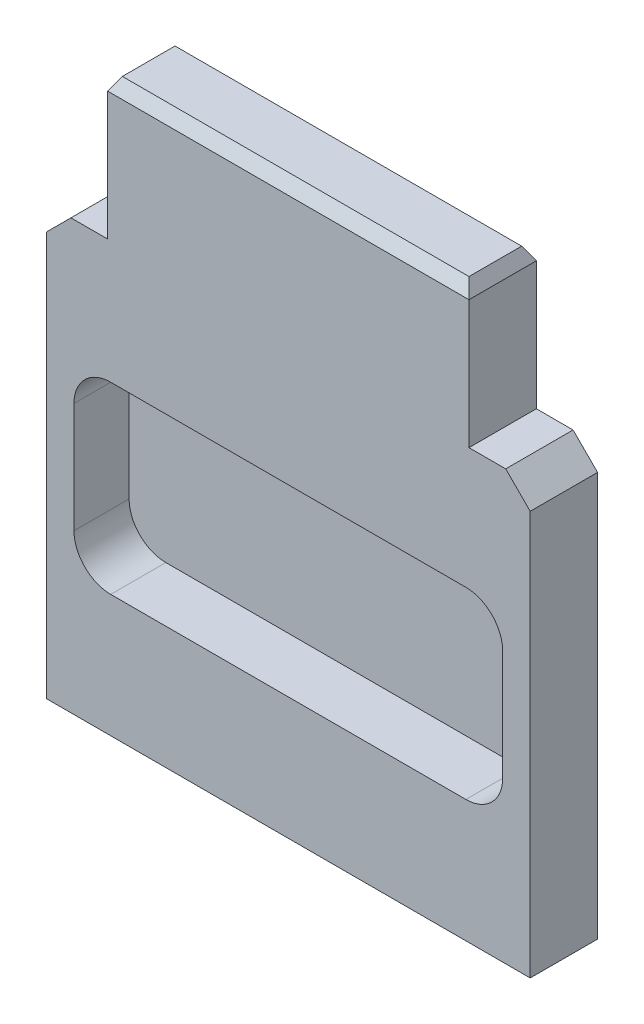
ISO-10303-21;
HEADER;
FILE_DESCRIPTION(('STEP AP214'),'2;1');
FILE_NAME('part.step','',(''),(''),'','','');
FILE_SCHEMA(('AUTOMOTIVE_DESIGN { 1 0 10303 214 1 1 1 1 }'));
ENDSEC;
DATA;
#1=APPLICATION_CONTEXT('core data for automotive mechanical design processes');
#2=APPLICATION_PROTOCOL_DEFINITION('international standard','automotive_design',2000,#1);
#3=PRODUCT_CONTEXT('',#1,'mechanical');
#4=PRODUCT('Part','Part','',(#3));
#5=PRODUCT_RELATED_PRODUCT_CATEGORY('part','',(#4));
#6=PRODUCT_DEFINITION_FORMATION('','',#4);
#7=PRODUCT_DEFINITION_CONTEXT('part definition',#1,'design');
#8=PRODUCT_DEFINITION('design','',#6,#7);
#9=PRODUCT_DEFINITION_SHAPE('','',#8);
#10=(LENGTH_UNIT() NAMED_UNIT(*) SI_UNIT(.MILLI.,.METRE.));
#11=(NAMED_UNIT(*) PLANE_ANGLE_UNIT() SI_UNIT($,.RADIAN.));
#12=(NAMED_UNIT(*) SI_UNIT($,.STERADIAN.) SOLID_ANGLE_UNIT());
#13=UNCERTAINTY_MEASURE_WITH_UNIT(LENGTH_MEASURE(1.E-05),#10,'distance_accuracy_value','');
#14=(GEOMETRIC_REPRESENTATION_CONTEXT(3) GLOBAL_UNCERTAINTY_ASSIGNED_CONTEXT((#13)) GLOBAL_UNIT_ASSIGNED_CONTEXT((#10,
#11,#12)) REPRESENTATION_CONTEXT('',''));
#15=CARTESIAN_POINT('',(0.,0.,0.));
#16=DIRECTION('',(0.,0.,1.));
#17=DIRECTION('',(1.,0.,0.));
#18=AXIS2_PLACEMENT_3D('',#15,#16,#17);
#19=CARTESIAN_POINT('',(-19.75,0.,5.5));
#20=DIRECTION('',(1.,0.,0.));
#21=DIRECTION('',(0.,0.,-1.));
#22=AXIS2_PLACEMENT_3D('',#19,#20,#21);
#23=PLANE('',#22);
#24=DIRECTION('',(0.,-1.,0.));
#25=VECTOR('',#24,1.);
#26=CARTESIAN_POINT('',(-19.75,0.,0.));
#27=LINE('',#26,#25);
#28=CARTESIAN_POINT('',(-19.75,33.,0.));
#29=VERTEX_POINT('',#28);
#30=CARTESIAN_POINT('',(-19.75,0.,0.));
#31=VERTEX_POINT('',#30);
#32=EDGE_CURVE('E201',#29,#31,#27,.T.);
#33=ORIENTED_EDGE('',*,*,#32,.T.);
#34=DIRECTION('',(0.,0.,-1.));
#35=VECTOR('',#34,1.);
#36=CARTESIAN_POINT('',(-19.75,0.,5.5));
#37=LINE('',#36,#35);
#38=CARTESIAN_POINT('',(-19.75,0.,5.5));
#39=VERTEX_POINT('',#38);
#40=EDGE_CURVE('E181',#39,#31,#37,.T.);
#41=ORIENTED_EDGE('',*,*,#40,.F.);
#42=DIRECTION('',(0.,-1.,0.));
#43=VECTOR('',#42,1.);
#44=CARTESIAN_POINT('',(-19.75,0.,5.5));
#45=LINE('',#44,#43);
#46=CARTESIAN_POINT('',(-19.75,33.,5.5));
#47=VERTEX_POINT('',#46);
#48=EDGE_CURVE('E188',#47,#39,#45,.T.);
#49=ORIENTED_EDGE('',*,*,#48,.F.);
#50=DIRECTION('',(0.,0.,-1.));
#51=VECTOR('',#50,1.);
#52=CARTESIAN_POINT('',(-19.75,33.,5.5));
#53=LINE('',#52,#51);
#54=EDGE_CURVE('E309',#47,#29,#53,.T.);
#55=ORIENTED_EDGE('',*,*,#54,.T.);
#56=EDGE_LOOP('',(#33,#41,#49,#55));
#57=FACE_BOUND('',#56,.T.);
#58=ADVANCED_FACE('F39',(#57),#23,.F.);
#59=CARTESIAN_POINT('',(19.75,0.,5.5));
#60=DIRECTION('',(0.,1.,0.));
#61=DIRECTION('',(0.,0.,1.));
#62=AXIS2_PLACEMENT_3D('',#59,#60,#61);
#63=PLANE('',#62);
#64=CARTESIAN_POINT('',(0.,0.,2.5));
#65=DIRECTION('',(0.,1.,0.));
#66=DIRECTION('',(0.,0.,1.));
#67=AXIS2_PLACEMENT_3D('',#64,#65,#66);
#68=CIRCLE('',#67,1.);
#69=CARTESIAN_POINT('',(0.,0.,3.5));
#70=VERTEX_POINT('',#69);
#71=EDGE_CURVE('E12',#70,#70,#68,.F.);
#72=ORIENTED_EDGE('',*,*,#71,.F.);
#73=EDGE_LOOP('',(#72));
#74=FACE_BOUND('',#73,.T.);
#75=DIRECTION('',(1.,0.,0.));
#76=VECTOR('',#75,1.);
#77=CARTESIAN_POINT('',(19.75,0.,0.));
#78=LINE('',#77,#76);
#79=CARTESIAN_POINT('',(19.75,0.,0.));
#80=VERTEX_POINT('',#79);
#81=EDGE_CURVE('E311',#31,#80,#78,.T.);
#82=ORIENTED_EDGE('',*,*,#81,.T.);
#83=DIRECTION('',(0.,0.,-1.));
#84=VECTOR('',#83,1.);
#85=CARTESIAN_POINT('',(19.75,0.,5.5));
#86=LINE('',#85,#84);
#87=CARTESIAN_POINT('',(19.75,0.,5.5));
#88=VERTEX_POINT('',#87);
#89=EDGE_CURVE('E184',#88,#80,#86,.T.);
#90=ORIENTED_EDGE('',*,*,#89,.F.);
#91=DIRECTION('',(1.,0.,0.));
#92=VECTOR('',#91,1.);
#93=CARTESIAN_POINT('',(19.75,0.,5.5));
#94=LINE('',#93,#92);
#95=EDGE_CURVE('E177',#39,#88,#94,.T.);
#96=ORIENTED_EDGE('',*,*,#95,.F.);
#97=ORIENTED_EDGE('',*,*,#40,.T.);
#98=EDGE_LOOP('',(#82,#90,#96,#97));
#99=FACE_BOUND('',#98,.T.);
#100=ADVANCED_FACE('F179',(#74,#99),#63,.F.);
#101=CARTESIAN_POINT('',(19.75,0.,5.5));
#102=DIRECTION('',(-1.,0.,0.));
#103=DIRECTION('',(0.,0.,1.));
#104=AXIS2_PLACEMENT_3D('',#101,#102,#103);
#105=PLANE('',#104);
#106=DIRECTION('',(0.,1.,0.));
#107=VECTOR('',#106,1.);
#108=CARTESIAN_POINT('',(19.75,0.,0.));
#109=LINE('',#108,#107);
#110=CARTESIAN_POINT('',(19.75,33.,0.));
#111=VERTEX_POINT('',#110);
#112=EDGE_CURVE('E313',#80,#111,#109,.T.);
#113=ORIENTED_EDGE('',*,*,#112,.T.);
#114=DIRECTION('',(0.,0.,-1.));
#115=VECTOR('',#114,1.);
#116=CARTESIAN_POINT('',(19.75,33.,5.5));
#117=LINE('',#116,#115);
#118=CARTESIAN_POINT('',(19.75,33.,5.5));
#119=VERTEX_POINT('',#118);
#120=EDGE_CURVE('E206',#119,#111,#117,.T.);
#121=ORIENTED_EDGE('',*,*,#120,.F.);
#122=DIRECTION('',(0.,1.,0.));
#123=VECTOR('',#122,1.);
#124=CARTESIAN_POINT('',(19.75,0.,5.5));
#125=LINE('',#124,#123);
#126=EDGE_CURVE('E187',#88,#119,#125,.T.);
#127=ORIENTED_EDGE('',*,*,#126,.F.);
#128=ORIENTED_EDGE('',*,*,#89,.T.);
#129=EDGE_LOOP('',(#113,#121,#127,#128));
#130=FACE_BOUND('',#129,.T.);
#131=ADVANCED_FACE('F363',(#130),#105,.F.);
#132=CARTESIAN_POINT('',(19.75,33.,5.5));
#133=DIRECTION('',(-0.707106781186545,-0.70710678118655,0.));
#134=DIRECTION('',(0.70710678118655,-0.707106781186545,0.));
#135=AXIS2_PLACEMENT_3D('',#132,#133,#134);
#136=PLANE('',#135);
#137=DIRECTION('',(-0.70710678118655,0.707106781186545,0.));
#138=VECTOR('',#137,1.);
#139=CARTESIAN_POINT('',(19.75,33.,0.));
#140=LINE('',#139,#138);
#141=CARTESIAN_POINT('',(17.75,35.,0.));
#142=VERTEX_POINT('',#141);
#143=EDGE_CURVE('E315',#111,#142,#140,.T.);
#144=ORIENTED_EDGE('',*,*,#143,.T.);
#145=DIRECTION('',(0.,0.,-1.));
#146=VECTOR('',#145,1.);
#147=CARTESIAN_POINT('',(17.75,35.,5.5));
#148=LINE('',#147,#146);
#149=CARTESIAN_POINT('',(17.75,35.,5.5));
#150=VERTEX_POINT('',#149);
#151=EDGE_CURVE('E337',#150,#142,#148,.T.);
#152=ORIENTED_EDGE('',*,*,#151,.F.);
#153=DIRECTION('',(-0.70710678118655,0.707106781186545,0.));
#154=VECTOR('',#153,1.);
#155=CARTESIAN_POINT('',(19.75,33.,5.5));
#156=LINE('',#155,#154);
#157=EDGE_CURVE('E298',#119,#150,#156,.T.);
#158=ORIENTED_EDGE('',*,*,#157,.F.);
#159=ORIENTED_EDGE('',*,*,#120,.T.);
#160=EDGE_LOOP('',(#144,#152,#158,#159));
#161=FACE_BOUND('',#160,.T.);
#162=ADVANCED_FACE('F344',(#161),#136,.F.);
#163=CARTESIAN_POINT('',(17.75,35.,5.5));
#164=DIRECTION('',(0.,-1.,0.));
#165=DIRECTION('',(0.,0.,-1.));
#166=AXIS2_PLACEMENT_3D('',#163,#164,#165);
#167=PLANE('',#166);
#168=DIRECTION('',(-1.,0.,0.));
#169=VECTOR('',#168,1.);
#170=CARTESIAN_POINT('',(17.75,35.,0.));
#171=LINE('',#170,#169);
#172=CARTESIAN_POINT('',(14.75,35.,0.));
#173=VERTEX_POINT('',#172);
#174=EDGE_CURVE('E317',#142,#173,#171,.T.);
#175=ORIENTED_EDGE('',*,*,#174,.T.);
#176=DIRECTION('',(0.,0.,-1.));
#177=VECTOR('',#176,1.);
#178=CARTESIAN_POINT('',(14.75,35.,5.5));
#179=LINE('',#178,#177);
#180=CARTESIAN_POINT('',(14.75,35.,5.5));
#181=VERTEX_POINT('',#180);
#182=EDGE_CURVE('E334',#181,#173,#179,.T.);
#183=ORIENTED_EDGE('',*,*,#182,.F.);
#184=DIRECTION('',(-1.,0.,0.));
#185=VECTOR('',#184,1.);
#186=CARTESIAN_POINT('',(17.75,35.,5.5));
#187=LINE('',#186,#185);
#188=EDGE_CURVE('E300',#150,#181,#187,.T.);
#189=ORIENTED_EDGE('',*,*,#188,.F.);
#190=ORIENTED_EDGE('',*,*,#151,.T.);
#191=EDGE_LOOP('',(#175,#183,#189,#190));
#192=FACE_BOUND('',#191,.T.);
#193=ADVANCED_FACE('F355',(#192),#167,.F.);
#194=CARTESIAN_POINT('',(14.75,35.,5.5));
#195=DIRECTION('',(-1.,0.,0.));
#196=DIRECTION('',(0.,0.,1.));
#197=AXIS2_PLACEMENT_3D('',#194,#195,#196);
#198=PLANE('',#197);
#199=DIRECTION('',(0.,1.,0.));
#200=VECTOR('',#199,1.);
#201=CARTESIAN_POINT('',(14.75,35.,0.));
#202=LINE('',#201,#200);
#203=CARTESIAN_POINT('',(14.75,45.4607695154587,0.));
#204=VERTEX_POINT('',#203);
#205=EDGE_CURVE('E319',#173,#204,#202,.T.);
#206=ORIENTED_EDGE('',*,*,#205,.T.);
#207=DIRECTION('',(0.,0.,1.));
#208=VECTOR('',#207,1.);
#209=CARTESIAN_POINT('',(14.75,45.4607695154587,5.5));
#210=LINE('',#209,#208);
#211=CARTESIAN_POINT('',(14.75,45.4607695154587,5.5));
#212=VERTEX_POINT('',#211);
#213=EDGE_CURVE('E216',#204,#212,#210,.T.);
#214=ORIENTED_EDGE('',*,*,#213,.T.);
#215=DIRECTION('',(0.,1.,0.));
#216=VECTOR('',#215,1.);
#217=CARTESIAN_POINT('',(14.75,35.,5.5));
#218=LINE('',#217,#216);
#219=EDGE_CURVE('E302',#181,#212,#218,.T.);
#220=ORIENTED_EDGE('',*,*,#219,.F.);
#221=ORIENTED_EDGE('',*,*,#182,.T.);
#222=EDGE_LOOP('',(#206,#214,#220,#221));
#223=FACE_BOUND('',#222,.T.);
#224=ADVANCED_FACE('F359',(#223),#198,.F.);
#225=CARTESIAN_POINT('',(-14.75,46.5,5.5));
#226=DIRECTION('',(0.,-1.,0.));
#227=DIRECTION('',(0.,0.,-1.));
#228=AXIS2_PLACEMENT_3D('',#225,#226,#227);
#229=PLANE('',#228);
#230=DIRECTION('',(1.,0.,0.));
#231=VECTOR('',#230,1.);
#232=CARTESIAN_POINT('',(-14.75,46.5,4.9));
#233=LINE('',#232,#231);
#234=CARTESIAN_POINT('',(-14.15,46.5,4.9));
#235=VERTEX_POINT('',#234);
#236=CARTESIAN_POINT('',(14.15,46.5,4.9));
#237=VERTEX_POINT('',#236);
#238=EDGE_CURVE('E211',#235,#237,#233,.T.);
#239=ORIENTED_EDGE('',*,*,#238,.T.);
#240=DIRECTION('',(0.,0.,-1.));
#241=VECTOR('',#240,1.);
#242=CARTESIAN_POINT('',(14.15,46.5,5.5));
#243=LINE('',#242,#241);
#244=CARTESIAN_POINT('',(14.15,46.5,0.599999999999996));
#245=VERTEX_POINT('',#244);
#246=EDGE_CURVE('E213',#237,#245,#243,.T.);
#247=ORIENTED_EDGE('',*,*,#246,.T.);
#248=DIRECTION('',(-1.,0.,0.));
#249=VECTOR('',#248,1.);
#250=CARTESIAN_POINT('',(-14.75,46.5,0.599999999999996));
#251=LINE('',#250,#249);
#252=CARTESIAN_POINT('',(-14.15,46.5,0.599999999999996));
#253=VERTEX_POINT('',#252);
#254=EDGE_CURVE('E202',#245,#253,#251,.T.);
#255=ORIENTED_EDGE('',*,*,#254,.T.);
#256=DIRECTION('',(0.,0.,1.));
#257=VECTOR('',#256,1.);
#258=CARTESIAN_POINT('',(-14.15,46.5,5.5));
#259=LINE('',#258,#257);
#260=EDGE_CURVE('E204',#253,#235,#259,.T.);
#261=ORIENTED_EDGE('',*,*,#260,.T.);
#262=EDGE_LOOP('',(#239,#247,#255,#261));
#263=FACE_BOUND('',#262,.T.);
#264=ADVANCED_FACE('F469',(#263),#229,.F.);
#265=CARTESIAN_POINT('',(-14.75,35.,5.5));
#266=DIRECTION('',(1.,0.,0.));
#267=DIRECTION('',(0.,0.,-1.));
#268=AXIS2_PLACEMENT_3D('',#265,#266,#267);
#269=PLANE('',#268);
#270=DIRECTION('',(0.,-1.,0.));
#271=VECTOR('',#270,1.);
#272=CARTESIAN_POINT('',(-14.75,35.,5.5));
#273=LINE('',#272,#271);
#274=CARTESIAN_POINT('',(-14.75,45.4607695154587,5.5));
#275=VERTEX_POINT('',#274);
#276=CARTESIAN_POINT('',(-14.75,35.,5.5));
#277=VERTEX_POINT('',#276);
#278=EDGE_CURVE('E304',#275,#277,#273,.T.);
#279=ORIENTED_EDGE('',*,*,#278,.F.);
#280=DIRECTION('',(0.,0.,-1.));
#281=VECTOR('',#280,1.);
#282=CARTESIAN_POINT('',(-14.75,45.4607695154587,5.5));
#283=LINE('',#282,#281);
#284=CARTESIAN_POINT('',(-14.75,45.4607695154587,0.));
#285=VERTEX_POINT('',#284);
#286=EDGE_CURVE('E221',#275,#285,#283,.T.);
#287=ORIENTED_EDGE('',*,*,#286,.T.);
#288=DIRECTION('',(0.,-1.,0.));
#289=VECTOR('',#288,1.);
#290=CARTESIAN_POINT('',(-14.75,35.,0.));
#291=LINE('',#290,#289);
#292=CARTESIAN_POINT('',(-14.75,35.,0.));
#293=VERTEX_POINT('',#292);
#294=EDGE_CURVE('E322',#285,#293,#291,.T.);
#295=ORIENTED_EDGE('',*,*,#294,.T.);
#296=DIRECTION('',(0.,0.,-1.));
#297=VECTOR('',#296,1.);
#298=CARTESIAN_POINT('',(-14.75,35.,5.5));
#299=LINE('',#298,#297);
#300=EDGE_CURVE('E331',#277,#293,#299,.T.);
#301=ORIENTED_EDGE('',*,*,#300,.F.);
#302=EDGE_LOOP('',(#279,#287,#295,#301));
#303=FACE_BOUND('',#302,.T.);
#304=ADVANCED_FACE('F465',(#303),#269,.F.);
#305=CARTESIAN_POINT('',(-17.75,35.,5.5));
#306=DIRECTION('',(0.,-1.,0.));
#307=DIRECTION('',(0.,0.,-1.));
#308=AXIS2_PLACEMENT_3D('',#305,#306,#307);
#309=PLANE('',#308);
#310=DIRECTION('',(-1.,0.,0.));
#311=VECTOR('',#310,1.);
#312=CARTESIAN_POINT('',(-17.75,35.,0.));
#313=LINE('',#312,#311);
#314=CARTESIAN_POINT('',(-17.75,35.,0.));
#315=VERTEX_POINT('',#314);
#316=EDGE_CURVE('E324',#293,#315,#313,.T.);
#317=ORIENTED_EDGE('',*,*,#316,.T.);
#318=DIRECTION('',(0.,0.,-1.));
#319=VECTOR('',#318,1.);
#320=CARTESIAN_POINT('',(-17.75,35.,5.5));
#321=LINE('',#320,#319);
#322=CARTESIAN_POINT('',(-17.75,35.,5.5));
#323=VERTEX_POINT('',#322);
#324=EDGE_CURVE('E328',#323,#315,#321,.T.);
#325=ORIENTED_EDGE('',*,*,#324,.F.);
#326=DIRECTION('',(-1.,0.,0.));
#327=VECTOR('',#326,1.);
#328=CARTESIAN_POINT('',(-17.75,35.,5.5));
#329=LINE('',#328,#327);
#330=EDGE_CURVE('E306',#277,#323,#329,.T.);
#331=ORIENTED_EDGE('',*,*,#330,.F.);
#332=ORIENTED_EDGE('',*,*,#300,.T.);
#333=EDGE_LOOP('',(#317,#325,#331,#332));
#334=FACE_BOUND('',#333,.T.);
#335=ADVANCED_FACE('F461',(#334),#309,.F.);
#336=CARTESIAN_POINT('',(-19.75,33.,5.5));
#337=DIRECTION('',(0.707106781186545,-0.70710678118655,0.));
#338=DIRECTION('',(0.70710678118655,0.707106781186545,0.));
#339=AXIS2_PLACEMENT_3D('',#336,#337,#338);
#340=PLANE('',#339);
#341=DIRECTION('',(-0.70710678118655,-0.707106781186545,0.));
#342=VECTOR('',#341,1.);
#343=CARTESIAN_POINT('',(-19.75,33.,0.));
#344=LINE('',#343,#342);
#345=EDGE_CURVE('E198',#315,#29,#344,.T.);
#346=ORIENTED_EDGE('',*,*,#345,.T.);
#347=ORIENTED_EDGE('',*,*,#54,.F.);
#348=DIRECTION('',(-0.70710678118655,-0.707106781186545,0.));
#349=VECTOR('',#348,1.);
#350=CARTESIAN_POINT('',(-19.75,33.,5.5));
#351=LINE('',#350,#349);
#352=EDGE_CURVE('E194',#323,#47,#351,.T.);
#353=ORIENTED_EDGE('',*,*,#352,.F.);
#354=ORIENTED_EDGE('',*,*,#324,.T.);
#355=EDGE_LOOP('',(#346,#347,#353,#354));
#356=FACE_BOUND('',#355,.T.);
#357=ADVANCED_FACE('F456',(#356),#340,.F.);
#358=CARTESIAN_POINT('',(0.,0.,5.5));
#359=DIRECTION('',(0.,0.,-1.));
#360=DIRECTION('',(-1.,0.,0.));
#361=AXIS2_PLACEMENT_3D('',#358,#359,#360);
#362=PLANE('',#361);
#363=DIRECTION('',(0.,1.,0.));
#364=VECTOR('',#363,1.);
#365=CARTESIAN_POINT('',(17.5,10.,5.5));
#366=LINE('',#365,#364);
#367=CARTESIAN_POINT('',(17.5,13.,5.5));
#368=VERTEX_POINT('',#367);
#369=CARTESIAN_POINT('',(17.5,22.,5.5));
#370=VERTEX_POINT('',#369);
#371=EDGE_CURVE('E269',#368,#370,#366,.T.);
#372=ORIENTED_EDGE('',*,*,#371,.F.);
#373=CARTESIAN_POINT('',(14.5,13.,5.5));
#374=DIRECTION('',(0.,0.,-1.));
#375=DIRECTION('',(-1.,0.,0.));
#376=AXIS2_PLACEMENT_3D('',#373,#374,#375);
#377=CIRCLE('',#376,3.);
#378=CARTESIAN_POINT('',(14.5,10.,5.5));
#379=VERTEX_POINT('',#378);
#380=EDGE_CURVE('E263',#368,#379,#377,.T.);
#381=ORIENTED_EDGE('',*,*,#380,.T.);
#382=DIRECTION('',(1.,0.,0.));
#383=VECTOR('',#382,1.);
#384=CARTESIAN_POINT('',(17.5,10.,5.5));
#385=LINE('',#384,#383);
#386=CARTESIAN_POINT('',(-14.5,10.,5.5));
#387=VERTEX_POINT('',#386);
#388=EDGE_CURVE('E276',#387,#379,#385,.T.);
#389=ORIENTED_EDGE('',*,*,#388,.F.);
#390=CARTESIAN_POINT('',(-14.5,13.,5.5));
#391=DIRECTION('',(0.,0.,-1.));
#392=DIRECTION('',(-1.,0.,0.));
#393=AXIS2_PLACEMENT_3D('',#390,#391,#392);
#394=CIRCLE('',#393,3.);
#395=CARTESIAN_POINT('',(-17.5,13.,5.5));
#396=VERTEX_POINT('',#395);
#397=EDGE_CURVE('E265',#387,#396,#394,.T.);
#398=ORIENTED_EDGE('',*,*,#397,.T.);
#399=DIRECTION('',(0.,-1.,0.));
#400=VECTOR('',#399,1.);
#401=CARTESIAN_POINT('',(-17.5,10.,5.5));
#402=LINE('',#401,#400);
#403=CARTESIAN_POINT('',(-17.5,22.,5.5));
#404=VERTEX_POINT('',#403);
#405=EDGE_CURVE('E416',#404,#396,#402,.T.);
#406=ORIENTED_EDGE('',*,*,#405,.F.);
#407=CARTESIAN_POINT('',(-14.5,22.,5.5));
#408=DIRECTION('',(0.,0.,-1.));
#409=DIRECTION('',(-1.,0.,0.));
#410=AXIS2_PLACEMENT_3D('',#407,#408,#409);
#411=CIRCLE('',#410,3.);
#412=CARTESIAN_POINT('',(-14.5,25.,5.5));
#413=VERTEX_POINT('',#412);
#414=EDGE_CURVE('E54',#404,#413,#411,.T.);
#415=ORIENTED_EDGE('',*,*,#414,.T.);
#416=DIRECTION('',(-1.,0.,0.));
#417=VECTOR('',#416,1.);
#418=CARTESIAN_POINT('',(17.5,25.,5.5));
#419=LINE('',#418,#417);
#420=CARTESIAN_POINT('',(14.5,25.,5.5));
#421=VERTEX_POINT('',#420);
#422=EDGE_CURVE('E270',#421,#413,#419,.T.);
#423=ORIENTED_EDGE('',*,*,#422,.F.);
#424=CARTESIAN_POINT('',(14.5,22.,5.5));
#425=DIRECTION('',(0.,0.,-1.));
#426=DIRECTION('',(-1.,0.,0.));
#427=AXIS2_PLACEMENT_3D('',#424,#425,#426);
#428=CIRCLE('',#427,3.);
#429=EDGE_CURVE('E47',#421,#370,#428,.T.);
#430=ORIENTED_EDGE('',*,*,#429,.T.);
#431=EDGE_LOOP('',(#372,#381,#389,#398,#406,#415,#423,#430));
#432=FACE_BOUND('',#431,.T.);
#433=ORIENTED_EDGE('',*,*,#219,.T.);
#434=DIRECTION('',(-1.,0.,0.));
#435=VECTOR('',#434,1.);
#436=CARTESIAN_POINT('',(0.,45.4607695154587,5.5));
#437=LINE('',#436,#435);
#438=EDGE_CURVE('E219',#212,#275,#437,.T.);
#439=ORIENTED_EDGE('',*,*,#438,.T.);
#440=ORIENTED_EDGE('',*,*,#278,.T.);
#441=ORIENTED_EDGE('',*,*,#330,.T.);
#442=ORIENTED_EDGE('',*,*,#352,.T.);
#443=ORIENTED_EDGE('',*,*,#48,.T.);
#444=ORIENTED_EDGE('',*,*,#95,.T.);
#445=ORIENTED_EDGE('',*,*,#126,.T.);
#446=ORIENTED_EDGE('',*,*,#157,.T.);
#447=ORIENTED_EDGE('',*,*,#188,.T.);
#448=EDGE_LOOP('',(#433,#439,#440,#441,#442,#443,#444,#445,#446,#447));
#449=FACE_BOUND('',#448,.T.);
#450=ADVANCED_FACE('F192',(#432,#449),#362,.F.);
#451=CARTESIAN_POINT('',(0.,0.,0.));
#452=DIRECTION('',(0.,0.,-1.));
#453=DIRECTION('',(-1.,0.,0.));
#454=AXIS2_PLACEMENT_3D('',#451,#452,#453);
#455=PLANE('',#454);
#456=ORIENTED_EDGE('',*,*,#294,.F.);
#457=DIRECTION('',(1.,0.,0.));
#458=VECTOR('',#457,1.);
#459=CARTESIAN_POINT('',(14.75,45.4607695154587,0.));
#460=LINE('',#459,#458);
#461=EDGE_CURVE('E223',#285,#204,#460,.T.);
#462=ORIENTED_EDGE('',*,*,#461,.T.);
#463=ORIENTED_EDGE('',*,*,#205,.F.);
#464=ORIENTED_EDGE('',*,*,#174,.F.);
#465=ORIENTED_EDGE('',*,*,#143,.F.);
#466=ORIENTED_EDGE('',*,*,#112,.F.);
#467=ORIENTED_EDGE('',*,*,#81,.F.);
#468=ORIENTED_EDGE('',*,*,#32,.F.);
#469=ORIENTED_EDGE('',*,*,#345,.F.);
#470=ORIENTED_EDGE('',*,*,#316,.F.);
#471=EDGE_LOOP('',(#456,#462,#463,#464,#465,#466,#467,#468,#469,#470));
#472=FACE_BOUND('',#471,.T.);
#473=ADVANCED_FACE('F351',(#472),#455,.T.);
#474=CARTESIAN_POINT('',(-14.75,45.4607695154587,5.5));
#475=DIRECTION('',(0.86602540378444,-0.499999999999998,0.));
#476=DIRECTION('',(0.,0.,-1.));
#477=AXIS2_PLACEMENT_3D('',#474,#475,#476);
#478=PLANE('',#477);
#479=DIRECTION('',(-0.447213595499956,-0.774596669241485,-0.447213595499956));
#480=VECTOR('',#479,1.);
#481=CARTESIAN_POINT('',(-14.27,46.2921539030917,0.479999999999998));
#482=LINE('',#481,#480);
#483=EDGE_CURVE('E231',#285,#253,#482,.F.);
#484=ORIENTED_EDGE('',*,*,#483,.F.);
#485=ORIENTED_EDGE('',*,*,#286,.F.);
#486=DIRECTION('',(0.447213595499956,0.774596669241485,-0.447213595499956));
#487=VECTOR('',#486,1.);
#488=CARTESIAN_POINT('',(-14.75,45.4607695154587,5.5));
#489=LINE('',#488,#487);
#490=EDGE_CURVE('E234',#235,#275,#489,.F.);
#491=ORIENTED_EDGE('',*,*,#490,.F.);
#492=ORIENTED_EDGE('',*,*,#260,.F.);
#493=EDGE_LOOP('',(#484,#485,#491,#492));
#494=FACE_BOUND('',#493,.T.);
#495=ADVANCED_FACE('F390',(#494),#478,.F.);
#496=CARTESIAN_POINT('',(0.,45.4607695154587,5.5));
#497=DIRECTION('',(0.,-0.499999999999998,-0.86602540378444));
#498=DIRECTION('',(-1.,0.,0.));
#499=AXIS2_PLACEMENT_3D('',#496,#497,#498);
#500=PLANE('',#499);
#501=ORIENTED_EDGE('',*,*,#490,.T.);
#502=ORIENTED_EDGE('',*,*,#438,.F.);
#503=DIRECTION('',(-0.447213595499956,0.774596669241485,-0.447213595499956));
#504=VECTOR('',#503,1.);
#505=CARTESIAN_POINT('',(11.8,50.5703193977869,2.55000000000002));
#506=LINE('',#505,#504);
#507=EDGE_CURVE('E228',#237,#212,#506,.F.);
#508=ORIENTED_EDGE('',*,*,#507,.F.);
#509=ORIENTED_EDGE('',*,*,#238,.F.);
#510=EDGE_LOOP('',(#501,#502,#508,#509));
#511=FACE_BOUND('',#510,.T.);
#512=ADVANCED_FACE('F386',(#511),#500,.F.);
#513=CARTESIAN_POINT('',(-14.75,46.5,0.599999999999996));
#514=DIRECTION('',(0.,0.499999999999998,-0.86602540378444));
#515=DIRECTION('',(1.,0.,0.));
#516=AXIS2_PLACEMENT_3D('',#513,#514,#515);
#517=PLANE('',#516);
#518=ORIENTED_EDGE('',*,*,#483,.T.);
#519=ORIENTED_EDGE('',*,*,#254,.F.);
#520=DIRECTION('',(-0.447213595499956,0.774596669241485,0.447213595499956));
#521=VECTOR('',#520,1.);
#522=CARTESIAN_POINT('',(8.37000000000004,56.5112536677481,6.37999999999996));
#523=LINE('',#522,#521);
#524=EDGE_CURVE('E226',#204,#245,#523,.T.);
#525=ORIENTED_EDGE('',*,*,#524,.F.);
#526=ORIENTED_EDGE('',*,*,#461,.F.);
#527=EDGE_LOOP('',(#518,#519,#525,#526));
#528=FACE_BOUND('',#527,.T.);
#529=ADVANCED_FACE('F382',(#528),#517,.T.);
#530=CARTESIAN_POINT('',(14.15,46.5,5.5));
#531=DIRECTION('',(-0.86602540378444,-0.499999999999998,0.));
#532=DIRECTION('',(0.,0.,-1.));
#533=AXIS2_PLACEMENT_3D('',#530,#531,#532);
#534=PLANE('',#533);
#535=ORIENTED_EDGE('',*,*,#507,.T.);
#536=ORIENTED_EDGE('',*,*,#213,.F.);
#537=ORIENTED_EDGE('',*,*,#524,.T.);
#538=ORIENTED_EDGE('',*,*,#246,.F.);
#539=EDGE_LOOP('',(#535,#536,#537,#538));
#540=FACE_BOUND('',#539,.T.);
#541=ADVANCED_FACE('F379',(#540),#534,.F.);
#542=CARTESIAN_POINT('',(0.,0.,1.));
#543=DIRECTION('',(0.,0.,-1.));
#544=DIRECTION('',(-1.,0.,0.));
#545=AXIS2_PLACEMENT_3D('',#542,#543,#544);
#546=PLANE('',#545);
#547=DIRECTION('',(1.,0.,0.));
#548=VECTOR('',#547,1.);
#549=CARTESIAN_POINT('',(17.5,10.,1.));
#550=LINE('',#549,#548);
#551=CARTESIAN_POINT('',(-14.5,10.,1.));
#552=VERTEX_POINT('',#551);
#553=CARTESIAN_POINT('',(14.5,10.,1.));
#554=VERTEX_POINT('',#553);
#555=EDGE_CURVE('E293',#552,#554,#550,.T.);
#556=ORIENTED_EDGE('',*,*,#555,.T.);
#557=CARTESIAN_POINT('',(14.5,13.,1.));
#558=DIRECTION('',(0.,0.,-1.));
#559=DIRECTION('',(-1.,0.,0.));
#560=AXIS2_PLACEMENT_3D('',#557,#558,#559);
#561=CIRCLE('',#560,3.);
#562=CARTESIAN_POINT('',(17.5,13.,1.));
#563=VERTEX_POINT('',#562);
#564=EDGE_CURVE('E252',#554,#563,#561,.F.);
#565=ORIENTED_EDGE('',*,*,#564,.T.);
#566=DIRECTION('',(0.,1.,0.));
#567=VECTOR('',#566,1.);
#568=CARTESIAN_POINT('',(17.5,10.,1.));
#569=LINE('',#568,#567);
#570=CARTESIAN_POINT('',(17.5,22.,1.));
#571=VERTEX_POINT('',#570);
#572=EDGE_CURVE('E286',#563,#571,#569,.T.);
#573=ORIENTED_EDGE('',*,*,#572,.T.);
#574=CARTESIAN_POINT('',(14.5,22.,1.));
#575=DIRECTION('',(0.,0.,-1.));
#576=DIRECTION('',(-1.,0.,0.));
#577=AXIS2_PLACEMENT_3D('',#574,#575,#576);
#578=CIRCLE('',#577,3.);
#579=CARTESIAN_POINT('',(14.5,25.,1.));
#580=VERTEX_POINT('',#579);
#581=EDGE_CURVE('E246',#571,#580,#578,.F.);
#582=ORIENTED_EDGE('',*,*,#581,.T.);
#583=DIRECTION('',(-1.,0.,0.));
#584=VECTOR('',#583,1.);
#585=CARTESIAN_POINT('',(17.5,25.,1.));
#586=LINE('',#585,#584);
#587=CARTESIAN_POINT('',(-14.5,25.,1.));
#588=VERTEX_POINT('',#587);
#589=EDGE_CURVE('E284',#580,#588,#586,.T.);
#590=ORIENTED_EDGE('',*,*,#589,.T.);
#591=CARTESIAN_POINT('',(-14.5,22.,1.));
#592=DIRECTION('',(0.,0.,-1.));
#593=DIRECTION('',(-1.,0.,0.));
#594=AXIS2_PLACEMENT_3D('',#591,#592,#593);
#595=CIRCLE('',#594,3.);
#596=CARTESIAN_POINT('',(-17.5,22.,1.));
#597=VERTEX_POINT('',#596);
#598=EDGE_CURVE('E248',#588,#597,#595,.F.);
#599=ORIENTED_EDGE('',*,*,#598,.T.);
#600=DIRECTION('',(0.,-1.,0.));
#601=VECTOR('',#600,1.);
#602=CARTESIAN_POINT('',(-17.5,10.,1.));
#603=LINE('',#602,#601);
#604=CARTESIAN_POINT('',(-17.5,13.,1.));
#605=VERTEX_POINT('',#604);
#606=EDGE_CURVE('E229',#597,#605,#603,.T.);
#607=ORIENTED_EDGE('',*,*,#606,.T.);
#608=CARTESIAN_POINT('',(-14.5,13.,1.));
#609=DIRECTION('',(0.,0.,-1.));
#610=DIRECTION('',(-1.,0.,0.));
#611=AXIS2_PLACEMENT_3D('',#608,#609,#610);
#612=CIRCLE('',#611,3.);
#613=EDGE_CURVE('E250',#605,#552,#612,.F.);
#614=ORIENTED_EDGE('',*,*,#613,.T.);
#615=EDGE_LOOP('',(#556,#565,#573,#582,#590,#599,#607,#614));
#616=FACE_BOUND('',#615,.T.);
#617=ADVANCED_FACE('F283',(#616),#546,.F.);
#618=CARTESIAN_POINT('',(17.5,10.,-38.0788655293195));
#619=DIRECTION('',(0.,-1.,0.));
#620=DIRECTION('',(1.,0.,0.));
#621=AXIS2_PLACEMENT_3D('',#618,#619,#620);
#622=PLANE('',#621);
#623=ORIENTED_EDGE('',*,*,#388,.T.);
#624=DIRECTION('',(0.,0.,1.));
#625=VECTOR('',#624,1.);
#626=CARTESIAN_POINT('',(14.5,10.,1.));
#627=LINE('',#626,#625);
#628=EDGE_CURVE('E244',#379,#554,#627,.F.);
#629=ORIENTED_EDGE('',*,*,#628,.T.);
#630=ORIENTED_EDGE('',*,*,#555,.F.);
#631=DIRECTION('',(0.,0.,1.));
#632=VECTOR('',#631,1.);
#633=CARTESIAN_POINT('',(-14.5,10.,5.5));
#634=LINE('',#633,#632);
#635=EDGE_CURVE('E241',#552,#387,#634,.T.);
#636=ORIENTED_EDGE('',*,*,#635,.T.);
#637=EDGE_LOOP('',(#623,#629,#630,#636));
#638=FACE_BOUND('',#637,.T.);
#639=ADVANCED_FACE('F422',(#638),#622,.F.);
#640=CARTESIAN_POINT('',(17.5,10.,-38.0788655293195));
#641=DIRECTION('',(1.,0.,0.));
#642=DIRECTION('',(0.,1.,0.));
#643=AXIS2_PLACEMENT_3D('',#640,#641,#642);
#644=PLANE('',#643);
#645=ORIENTED_EDGE('',*,*,#572,.F.);
#646=DIRECTION('',(0.,0.,1.));
#647=VECTOR('',#646,1.);
#648=CARTESIAN_POINT('',(17.5,13.,5.5));
#649=LINE('',#648,#647);
#650=EDGE_CURVE('E238',#563,#368,#649,.T.);
#651=ORIENTED_EDGE('',*,*,#650,.T.);
#652=ORIENTED_EDGE('',*,*,#371,.T.);
#653=DIRECTION('',(0.,0.,1.));
#654=VECTOR('',#653,1.);
#655=CARTESIAN_POINT('',(17.5,22.,1.));
#656=LINE('',#655,#654);
#657=EDGE_CURVE('E225',#370,#571,#656,.F.);
#658=ORIENTED_EDGE('',*,*,#657,.T.);
#659=EDGE_LOOP('',(#645,#651,#652,#658));
#660=FACE_BOUND('',#659,.T.);
#661=ADVANCED_FACE('F273',(#660),#644,.F.);
#662=CARTESIAN_POINT('',(17.5,25.,-38.0788655293195));
#663=DIRECTION('',(0.,1.,0.));
#664=DIRECTION('',(-1.,0.,0.));
#665=AXIS2_PLACEMENT_3D('',#662,#663,#664);
#666=PLANE('',#665);
#667=ORIENTED_EDGE('',*,*,#422,.T.);
#668=DIRECTION('',(0.,0.,1.));
#669=VECTOR('',#668,1.);
#670=CARTESIAN_POINT('',(-14.5,25.,1.));
#671=LINE('',#670,#669);
#672=EDGE_CURVE('E261',#413,#588,#671,.F.);
#673=ORIENTED_EDGE('',*,*,#672,.T.);
#674=ORIENTED_EDGE('',*,*,#589,.F.);
#675=DIRECTION('',(0.,0.,1.));
#676=VECTOR('',#675,1.);
#677=CARTESIAN_POINT('',(14.5,25.,5.5));
#678=LINE('',#677,#676);
#679=EDGE_CURVE('E259',#580,#421,#678,.T.);
#680=ORIENTED_EDGE('',*,*,#679,.T.);
#681=EDGE_LOOP('',(#667,#673,#674,#680));
#682=FACE_BOUND('',#681,.T.);
#683=ADVANCED_FACE('F288',(#682),#666,.F.);
#684=CARTESIAN_POINT('',(-17.5,10.,-38.0788655293195));
#685=DIRECTION('',(-1.,0.,0.));
#686=DIRECTION('',(0.,-1.,0.));
#687=AXIS2_PLACEMENT_3D('',#684,#685,#686);
#688=PLANE('',#687);
#689=ORIENTED_EDGE('',*,*,#405,.T.);
#690=DIRECTION('',(0.,0.,1.));
#691=VECTOR('',#690,1.);
#692=CARTESIAN_POINT('',(-17.5,13.,1.));
#693=LINE('',#692,#691);
#694=EDGE_CURVE('E257',#396,#605,#693,.F.);
#695=ORIENTED_EDGE('',*,*,#694,.T.);
#696=ORIENTED_EDGE('',*,*,#606,.F.);
#697=DIRECTION('',(0.,0.,1.));
#698=VECTOR('',#697,1.);
#699=CARTESIAN_POINT('',(-17.5,22.,5.5));
#700=LINE('',#699,#698);
#701=EDGE_CURVE('E254',#597,#404,#700,.T.);
#702=ORIENTED_EDGE('',*,*,#701,.T.);
#703=EDGE_LOOP('',(#689,#695,#696,#702));
#704=FACE_BOUND('',#703,.T.);
#705=ADVANCED_FACE('F399',(#704),#688,.F.);
#706=CARTESIAN_POINT('',(14.5,13.,-38.0788655293195));
#707=DIRECTION('',(0.,0.,-1.));
#708=DIRECTION('',(-1.,0.,0.));
#709=AXIS2_PLACEMENT_3D('',#706,#707,#708);
#710=CYLINDRICAL_SURFACE('',#709,3.);
#711=ORIENTED_EDGE('',*,*,#564,.F.);
#712=ORIENTED_EDGE('',*,*,#628,.F.);
#713=ORIENTED_EDGE('',*,*,#380,.F.);
#714=ORIENTED_EDGE('',*,*,#650,.F.);
#715=EDGE_LOOP('',(#711,#712,#713,#714));
#716=FACE_BOUND('',#715,.T.);
#717=ADVANCED_FACE('F395',(#716),#710,.F.);
#718=CARTESIAN_POINT('',(-14.5,13.,-38.0788655293195));
#719=DIRECTION('',(0.,0.,-1.));
#720=DIRECTION('',(-1.,0.,0.));
#721=AXIS2_PLACEMENT_3D('',#718,#719,#720);
#722=CYLINDRICAL_SURFACE('',#721,3.);
#723=ORIENTED_EDGE('',*,*,#613,.F.);
#724=ORIENTED_EDGE('',*,*,#694,.F.);
#725=ORIENTED_EDGE('',*,*,#397,.F.);
#726=ORIENTED_EDGE('',*,*,#635,.F.);
#727=EDGE_LOOP('',(#723,#724,#725,#726));
#728=FACE_BOUND('',#727,.T.);
#729=ADVANCED_FACE('F398',(#728),#722,.F.);
#730=CARTESIAN_POINT('',(-14.5,22.,-38.0788655293195));
#731=DIRECTION('',(0.,0.,-1.));
#732=DIRECTION('',(-1.,0.,0.));
#733=AXIS2_PLACEMENT_3D('',#730,#731,#732);
#734=CYLINDRICAL_SURFACE('',#733,3.);
#735=ORIENTED_EDGE('',*,*,#598,.F.);
#736=ORIENTED_EDGE('',*,*,#672,.F.);
#737=ORIENTED_EDGE('',*,*,#414,.F.);
#738=ORIENTED_EDGE('',*,*,#701,.F.);
#739=EDGE_LOOP('',(#735,#736,#737,#738));
#740=FACE_BOUND('',#739,.T.);
#741=ADVANCED_FACE('F402',(#740),#734,.F.);
#742=CARTESIAN_POINT('',(14.5,22.,-38.0788655293195));
#743=DIRECTION('',(0.,0.,-1.));
#744=DIRECTION('',(-1.,0.,0.));
#745=AXIS2_PLACEMENT_3D('',#742,#743,#744);
#746=CYLINDRICAL_SURFACE('',#745,3.);
#747=ORIENTED_EDGE('',*,*,#581,.F.);
#748=ORIENTED_EDGE('',*,*,#657,.F.);
#749=ORIENTED_EDGE('',*,*,#429,.F.);
#750=ORIENTED_EDGE('',*,*,#679,.F.);
#751=EDGE_LOOP('',(#747,#748,#749,#750));
#752=FACE_BOUND('',#751,.T.);
#753=ADVANCED_FACE('F41',(#752),#746,.F.);
#754=CARTESIAN_POINT('',(0.,-1.5,2.5));
#755=DIRECTION('',(0.,1.,0.));
#756=DIRECTION('',(0.,0.,1.));
#757=AXIS2_PLACEMENT_3D('',#754,#755,#756);
#758=CYLINDRICAL_SURFACE('',#757,1.);
#759=CARTESIAN_POINT('',(0.,-1.5,2.5));
#760=DIRECTION('',(0.,-1.,0.));
#761=DIRECTION('',(0.,0.,-1.));
#762=AXIS2_PLACEMENT_3D('',#759,#760,#761);
#763=CIRCLE('',#762,1.);
#764=CARTESIAN_POINT('',(0.,-1.5,1.5));
#765=VERTEX_POINT('',#764);
#766=EDGE_CURVE('E428',#765,#765,#763,.T.);
#767=ORIENTED_EDGE('',*,*,#766,.F.);
#768=EDGE_LOOP('',(#767));
#769=FACE_BOUND('',#768,.T.);
#770=ORIENTED_EDGE('',*,*,#71,.T.);
#771=EDGE_LOOP('',(#770));
#772=FACE_BOUND('',#771,.T.);
#773=ADVANCED_FACE('F409',(#769,#772),#758,.T.);
#774=CARTESIAN_POINT('',(0.,-1.5,2.5));
#775=DIRECTION('',(0.,-1.,0.));
#776=DIRECTION('',(0.,0.,-1.));
#777=AXIS2_PLACEMENT_3D('',#774,#775,#776);
#778=PLANE('',#777);
#779=ORIENTED_EDGE('',*,*,#766,.T.);
#780=EDGE_LOOP('',(#779));
#781=FACE_BOUND('',#780,.T.);
#782=ADVANCED_FACE('F433',(#781),#778,.T.);
#783=CLOSED_SHELL('',(#58,#100,#131,#162,#193,#224,#264,#304,#335,#357,#450,#473,#495,#512,#529,
#541,#617,#639,#661,#683,#705,#717,#729,#741,#753,#773,#782));
#784=MANIFOLD_SOLID_BREP('B2',#783);
#785=ADVANCED_BREP_SHAPE_REPRESENTATION('',(#18,#784),#14);
#786=SHAPE_DEFINITION_REPRESENTATION(#9,#785);
ENDSEC;
END-ISO-10303-21;
